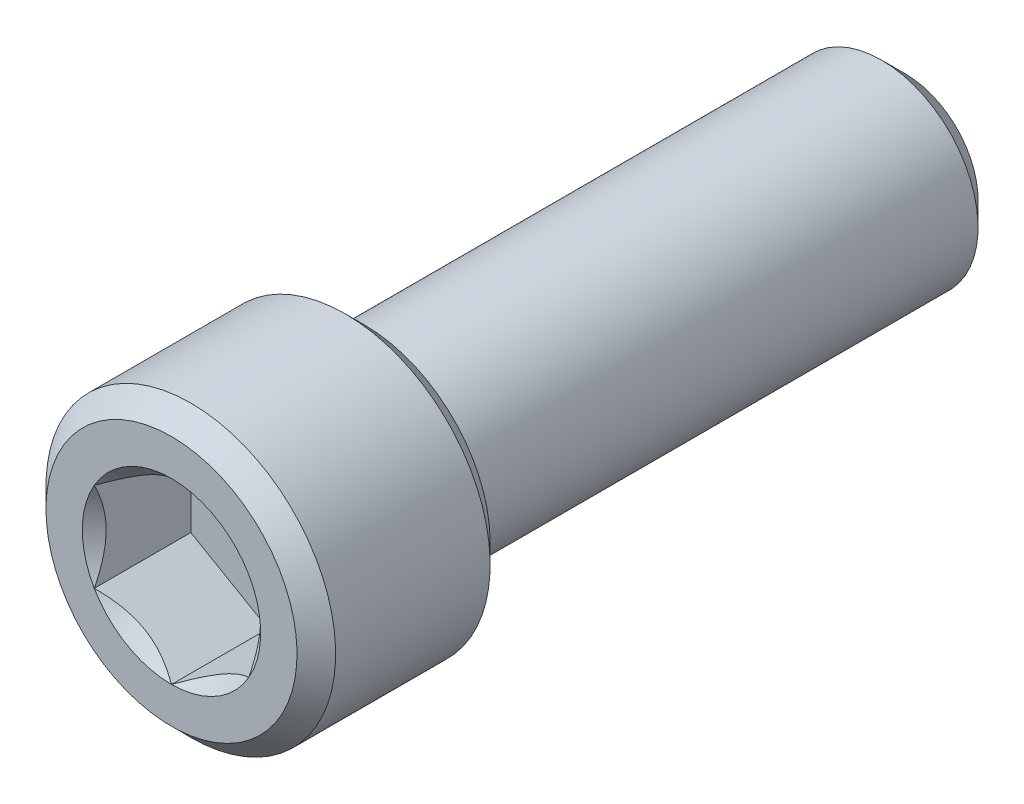
ISO-10303-21;
HEADER;
FILE_DESCRIPTION(('STEP AP214'),'2;1');
FILE_NAME('part.step','',(''),(''),'','','');
FILE_SCHEMA(('AUTOMOTIVE_DESIGN { 1 0 10303 214 1 1 1 1 }'));
ENDSEC;
DATA;
#1=APPLICATION_CONTEXT('core data for automotive mechanical design processes');
#2=APPLICATION_PROTOCOL_DEFINITION('international standard','automotive_design',2000,#1);
#3=PRODUCT_CONTEXT('',#1,'mechanical');
#4=PRODUCT('Part','Part','',(#3));
#5=PRODUCT_RELATED_PRODUCT_CATEGORY('part','',(#4));
#6=PRODUCT_DEFINITION_FORMATION('','',#4);
#7=PRODUCT_DEFINITION_CONTEXT('part definition',#1,'design');
#8=PRODUCT_DEFINITION('design','',#6,#7);
#9=PRODUCT_DEFINITION_SHAPE('','',#8);
#10=(LENGTH_UNIT() NAMED_UNIT(*) SI_UNIT(.MILLI.,.METRE.));
#11=(NAMED_UNIT(*) PLANE_ANGLE_UNIT() SI_UNIT($,.RADIAN.));
#12=(NAMED_UNIT(*) SI_UNIT($,.STERADIAN.) SOLID_ANGLE_UNIT());
#13=UNCERTAINTY_MEASURE_WITH_UNIT(LENGTH_MEASURE(1.E-05),#10,'distance_accuracy_value','');
#14=(GEOMETRIC_REPRESENTATION_CONTEXT(3) GLOBAL_UNCERTAINTY_ASSIGNED_CONTEXT((#13)) GLOBAL_UNIT_ASSIGNED_CONTEXT((#10,
#11,#12)) REPRESENTATION_CONTEXT('',''));
#15=CARTESIAN_POINT('',(0.,0.,0.));
#16=DIRECTION('',(0.,0.,1.));
#17=DIRECTION('',(1.,0.,0.));
#18=AXIS2_PLACEMENT_3D('',#15,#16,#17);
#19=CARTESIAN_POINT('',(0.,2.98732222222222,-15.08125));
#20=DIRECTION('',(0.,0.,-1.));
#21=DIRECTION('',(0.,1.,0.));
#22=AXIS2_PLACEMENT_3D('',#19,#20,#21);
#23=PLANE('',#22);
#24=CARTESIAN_POINT('',(0.,0.,-15.08125));
#25=DIRECTION('',(0.,0.,-1.));
#26=DIRECTION('',(0.,1.,0.));
#27=AXIS2_PLACEMENT_3D('',#24,#25,#26);
#28=CIRCLE('',#27,2.98732222222222);
#29=CARTESIAN_POINT('',(0.,2.98732222222222,-15.08125));
#30=VERTEX_POINT('',#29);
#31=EDGE_CURVE('E203',#30,#30,#28,.T.);
#32=ORIENTED_EDGE('',*,*,#31,.T.);
#33=EDGE_LOOP('',(#32));
#34=FACE_BOUND('',#33,.T.);
#35=ADVANCED_FACE('F34',(#34),#23,.T.);
#36=CARTESIAN_POINT('',(0.,0.,15.08125));
#37=DIRECTION('',(0.,0.,1.));
#38=DIRECTION('',(0.,-1.,0.));
#39=AXIS2_PLACEMENT_3D('',#36,#37,#38);
#40=PLANE('',#39);
#41=CARTESIAN_POINT('',(0.,0.,15.08125));
#42=DIRECTION('',(0.,0.,1.));
#43=DIRECTION('',(1.,0.,0.));
#44=AXIS2_PLACEMENT_3D('',#41,#42,#43);
#45=CIRCLE('',#44,3.66617420935413);
#46=CARTESIAN_POINT('',(0.,-3.66617420935413,15.08125));
#47=VERTEX_POINT('',#46);
#48=CARTESIAN_POINT('',(3.17500000000002,-1.83308710467705,15.08125));
#49=VERTEX_POINT('',#48);
#50=EDGE_CURVE('E103',#47,#49,#45,.T.);
#51=ORIENTED_EDGE('',*,*,#50,.F.);
#52=CARTESIAN_POINT('',(-3.175,-1.83308710467706,15.08125));
#53=VERTEX_POINT('',#52);
#54=EDGE_CURVE('E93',#53,#47,#45,.T.);
#55=ORIENTED_EDGE('',*,*,#54,.F.);
#56=CARTESIAN_POINT('',(-3.17500000000001,1.83308710467706,15.08125));
#57=VERTEX_POINT('',#56);
#58=EDGE_CURVE('E102',#57,#53,#45,.T.);
#59=ORIENTED_EDGE('',*,*,#58,.F.);
#60=CARTESIAN_POINT('',(0.,3.66617420935413,15.08125));
#61=VERTEX_POINT('',#60);
#62=EDGE_CURVE('E53',#61,#57,#45,.T.);
#63=ORIENTED_EDGE('',*,*,#62,.F.);
#64=CARTESIAN_POINT('',(3.175,1.83308710467707,15.08125));
#65=VERTEX_POINT('',#64);
#66=EDGE_CURVE('E60',#65,#61,#45,.T.);
#67=ORIENTED_EDGE('',*,*,#66,.F.);
#68=EDGE_CURVE('E131',#49,#65,#45,.T.);
#69=ORIENTED_EDGE('',*,*,#68,.F.);
#70=EDGE_LOOP('',(#51,#55,#59,#63,#67,#69));
#71=FACE_BOUND('',#70,.T.);
#72=CARTESIAN_POINT('',(0.,0.,15.08125));
#73=DIRECTION('',(0.,0.,-1.));
#74=DIRECTION('',(0.,1.,0.));
#75=AXIS2_PLACEMENT_3D('',#72,#73,#74);
#76=CIRCLE('',#75,5.159375);
#77=CARTESIAN_POINT('',(0.,5.159375,15.08125));
#78=VERTEX_POINT('',#77);
#79=EDGE_CURVE('E47',#78,#78,#76,.T.);
#80=ORIENTED_EDGE('',*,*,#79,.F.);
#81=EDGE_LOOP('',(#80));
#82=FACE_BOUND('',#81,.T.);
#83=ADVANCED_FACE('F129',(#71,#82),#40,.T.);
#84=CARTESIAN_POINT('',(0.,0.,14.2875));
#85=DIRECTION('',(0.,0.,-1.));
#86=DIRECTION('',(0.,1.,0.));
#87=AXIS2_PLACEMENT_3D('',#84,#85,#86);
#88=CONICAL_SURFACE('',#87,5.953125,0.785398163397447);
#89=ORIENTED_EDGE('',*,*,#79,.T.);
#90=EDGE_LOOP('',(#89));
#91=FACE_BOUND('',#90,.T.);
#92=CARTESIAN_POINT('',(0.,0.,14.2875));
#93=DIRECTION('',(0.,0.,-1.));
#94=DIRECTION('',(0.,1.,0.));
#95=AXIS2_PLACEMENT_3D('',#92,#93,#94);
#96=CIRCLE('',#95,5.953125);
#97=CARTESIAN_POINT('',(0.,5.95312499999999,14.2875));
#98=VERTEX_POINT('',#97);
#99=EDGE_CURVE('E222',#98,#98,#96,.T.);
#100=ORIENTED_EDGE('',*,*,#99,.F.);
#101=EDGE_LOOP('',(#100));
#102=FACE_BOUND('',#101,.T.);
#103=ADVANCED_FACE('F200',(#91,#102),#88,.T.);
#104=CARTESIAN_POINT('',(0.,0.,-15.08125));
#105=DIRECTION('',(0.,0.,-1.));
#106=DIRECTION('',(0.,1.,0.));
#107=AXIS2_PLACEMENT_3D('',#104,#105,#106);
#108=CYLINDRICAL_SURFACE('',#107,5.953125);
#109=ORIENTED_EDGE('',*,*,#99,.T.);
#110=EDGE_LOOP('',(#109));
#111=FACE_BOUND('',#110,.T.);
#112=CARTESIAN_POINT('',(0.,0.,7.9375));
#113=DIRECTION('',(0.,0.,-1.));
#114=DIRECTION('',(0.,1.,0.));
#115=AXIS2_PLACEMENT_3D('',#112,#113,#114);
#116=CIRCLE('',#115,5.953125);
#117=CARTESIAN_POINT('',(0.,5.95312499999999,7.9375));
#118=VERTEX_POINT('',#117);
#119=EDGE_CURVE('E219',#118,#118,#116,.T.);
#120=ORIENTED_EDGE('',*,*,#119,.F.);
#121=EDGE_LOOP('',(#120));
#122=FACE_BOUND('',#121,.T.);
#123=ADVANCED_FACE('F229',(#111,#122),#108,.T.);
#124=CARTESIAN_POINT('',(0.,0.,7.14375));
#125=DIRECTION('',(0.,0.,1.));
#126=DIRECTION('',(0.,-1.,0.));
#127=AXIS2_PLACEMENT_3D('',#124,#125,#126);
#128=CONICAL_SURFACE('',#127,5.15937499999999,0.785398163397454);
#129=ORIENTED_EDGE('',*,*,#119,.T.);
#130=EDGE_LOOP('',(#129));
#131=FACE_BOUND('',#130,.T.);
#132=CARTESIAN_POINT('',(0.,0.,7.14375));
#133=DIRECTION('',(0.,0.,-1.));
#134=DIRECTION('',(0.,1.,0.));
#135=AXIS2_PLACEMENT_3D('',#132,#133,#134);
#136=CIRCLE('',#135,5.15937499999999);
#137=CARTESIAN_POINT('',(0.,5.15937499999999,7.14375));
#138=VERTEX_POINT('',#137);
#139=EDGE_CURVE('E216',#138,#138,#136,.T.);
#140=ORIENTED_EDGE('',*,*,#139,.F.);
#141=EDGE_LOOP('',(#140));
#142=FACE_BOUND('',#141,.T.);
#143=ADVANCED_FACE('F235',(#131,#142),#128,.T.);
#144=CARTESIAN_POINT('',(0.,5.15937499999999,7.14375));
#145=DIRECTION('',(0.,0.,-1.));
#146=DIRECTION('',(0.,1.,0.));
#147=AXIS2_PLACEMENT_3D('',#144,#145,#146);
#148=PLANE('',#147);
#149=ORIENTED_EDGE('',*,*,#139,.T.);
#150=EDGE_LOOP('',(#149));
#151=FACE_BOUND('',#150,.T.);
#152=CARTESIAN_POINT('',(0.,0.,7.14375));
#153=DIRECTION('',(0.,0.,-1.));
#154=DIRECTION('',(0.,1.,0.));
#155=AXIS2_PLACEMENT_3D('',#152,#153,#154);
#156=CIRCLE('',#155,3.9751);
#157=CARTESIAN_POINT('',(0.,3.9751,7.14375));
#158=VERTEX_POINT('',#157);
#159=EDGE_CURVE('E208',#158,#158,#156,.T.);
#160=ORIENTED_EDGE('',*,*,#159,.F.);
#161=EDGE_LOOP('',(#160));
#162=FACE_BOUND('',#161,.T.);
#163=ADVANCED_FACE('F241',(#151,#162),#148,.T.);
#164=CARTESIAN_POINT('',(0.,0.,-15.08125));
#165=DIRECTION('',(0.,0.,-1.));
#166=DIRECTION('',(0.,1.,0.));
#167=AXIS2_PLACEMENT_3D('',#164,#165,#166);
#168=CYLINDRICAL_SURFACE('',#167,3.97510000000001);
#169=ORIENTED_EDGE('',*,*,#159,.T.);
#170=EDGE_LOOP('',(#169));
#171=FACE_BOUND('',#170,.T.);
#172=CARTESIAN_POINT('',(0.,0.,-14.0934722222222));
#173=DIRECTION('',(0.,0.,-1.));
#174=DIRECTION('',(0.,1.,0.));
#175=AXIS2_PLACEMENT_3D('',#172,#173,#174);
#176=CIRCLE('',#175,3.97510000000001);
#177=CARTESIAN_POINT('',(0.,3.97510000000001,-14.0934722222222));
#178=VERTEX_POINT('',#177);
#179=EDGE_CURVE('E205',#178,#178,#176,.T.);
#180=ORIENTED_EDGE('',*,*,#179,.F.);
#181=EDGE_LOOP('',(#180));
#182=FACE_BOUND('',#181,.T.);
#183=ADVANCED_FACE('F247',(#171,#182),#168,.T.);
#184=CARTESIAN_POINT('',(0.,0.,-15.08125));
#185=DIRECTION('',(0.,0.,1.));
#186=DIRECTION('',(0.,-1.,0.));
#187=AXIS2_PLACEMENT_3D('',#184,#185,#186);
#188=CONICAL_SURFACE('',#187,2.98732222222222,0.78539816339745);
#189=ORIENTED_EDGE('',*,*,#179,.T.);
#190=EDGE_LOOP('',(#189));
#191=FACE_BOUND('',#190,.T.);
#192=ORIENTED_EDGE('',*,*,#31,.F.);
#193=EDGE_LOOP('',(#192));
#194=FACE_BOUND('',#193,.T.);
#195=ADVANCED_FACE('F253',(#191,#194),#188,.T.);
#196=CARTESIAN_POINT('',(0.,0.,15.08125));
#197=DIRECTION('',(0.,0.,1.));
#198=DIRECTION('',(1.,0.,0.));
#199=AXIS2_PLACEMENT_3D('',#196,#197,#198);
#200=CONICAL_SURFACE('',#199,3.66617420935413,0.78539816339745);
#201=ORIENTED_EDGE('',*,*,#50,.T.);
#202=CARTESIAN_POINT('',(-0.000199999999998825,-3.66628967940796,15.0813654755089));
#203=CARTESIAN_POINT('',(0.108938349949826,-3.60327862368552,15.0184089836918));
#204=CARTESIAN_POINT('',(0.219901628077945,-3.53921394518808,14.9591501042347));
#205=CARTESIAN_POINT('',(0.446167846345947,-3.40857908316253,14.8506486557305));
#206=CARTESIAN_POINT('',(0.561492303252262,-3.34199647692352,14.8014664539387));
#207=CARTESIAN_POINT('',(0.794038522480624,-3.207735854653,14.717216458874));
#208=CARTESIAN_POINT('',(0.911201066281148,-3.14009202845083,14.6819369144994));
#209=CARTESIAN_POINT('',(1.14810544464628,-3.00331522182952,14.6275815701348));
#210=CARTESIAN_POINT('',(1.26784004264355,-2.93418641944448,14.6084651975296));
#211=CARTESIAN_POINT('',(1.47419791875157,-2.81504564412411,14.5912171306232));
#212=CARTESIAN_POINT('',(1.56055470772915,-2.76518752876156,14.5886639336138));
#213=CARTESIAN_POINT('',(1.73312781652471,-2.66555239794355,14.5929662731233));
#214=CARTESIAN_POINT('',(1.8193440764928,-2.61577541704245,14.5998251080214));
#215=CARTESIAN_POINT('',(1.99095979158712,-2.51669303773557,14.6225598833037));
#216=CARTESIAN_POINT('',(2.07635822425327,-2.4673882296474,14.6384459096873));
#217=CARTESIAN_POINT('',(2.24568840330547,-2.36962540518969,14.6783679839979));
#218=CARTESIAN_POINT('',(2.32962026161974,-2.32116732419836,14.7024034070852));
#219=CARTESIAN_POINT('',(2.47862357928411,-2.23514021863469,14.7518552344172));
#220=CARTESIAN_POINT('',(2.54402485119173,-2.19738077669348,14.775971719301));
#221=CARTESIAN_POINT('',(2.6736532502051,-2.12253978562849,14.8280914671371));
#222=CARTESIAN_POINT('',(2.73788034144172,-2.08545825721376,14.8560948486035));
#223=CARTESIAN_POINT('',(2.8649580345126,-2.01208991691129,14.9153605655445));
#224=CARTESIAN_POINT('',(2.92781225074872,-1.97580101824766,14.9466126533542));
#225=CARTESIAN_POINT('',(3.05235662084809,-1.90389529264474,15.0119653443919));
#226=CARTESIAN_POINT('',(3.11404746097871,-1.86827806948879,15.0460641995185));
#227=CARTESIAN_POINT('',(3.1752,-1.83297163462322,15.0813654755089));
#228=B_SPLINE_CURVE_WITH_KNOTS('',3,(#202,#203,#204,#205,#206,#207,#208,#209,#210,#211,#212,
#213,#214,#215,#216,#217,#218,#219,#220,#221,#222,#223,#224,#225,#226,#227),.UNSPECIFIED.,.F.,
.F.,(4,2,2,2,2,2,2,2,2,2,2,2,4),(0.,0.422910572436807,0.848285055427806,1.26690402276127,
1.68446903107506,1.98329272958351,2.28222117546889,2.58148426995465,2.88072442418451,
3.11844134429545,3.35616551414405,3.59316134346766,3.8300126974443),.UNSPECIFIED.);
#229=EDGE_CURVE('E11',#47,#49,#228,.T.);
#230=ORIENTED_EDGE('',*,*,#229,.F.);
#231=EDGE_LOOP('',(#201,#230));
#232=FACE_BOUND('',#231,.T.);
#233=ADVANCED_FACE('F107',(#232),#200,.F.);
#234=ORIENTED_EDGE('',*,*,#68,.T.);
#235=CARTESIAN_POINT('',(3.175,-3.65592387452515,16.2572245261065));
#236=CARTESIAN_POINT('',(3.175,-3.56690614739901,16.1900295572879));
#237=CARTESIAN_POINT('',(3.175,-3.47739001482927,16.1234841167795));
#238=CARTESIAN_POINT('',(3.175,-3.29716433407818,15.991983107989));
#239=CARTESIAN_POINT('',(3.175,-3.20645449195235,15.9270279430093));
#240=CARTESIAN_POINT('',(3.175,-3.02298124672424,15.7985364725883));
#241=CARTESIAN_POINT('',(3.175,-2.93020737789476,15.7350150605195));
#242=CARTESIAN_POINT('',(3.175,-2.74308490461526,15.6103432312395));
#243=CARTESIAN_POINT('',(3.175,-2.64873641209623,15.549192646518));
#244=CARTESIAN_POINT('',(3.175,-2.45276910629101,15.4263772914686));
#245=CARTESIAN_POINT('',(3.175,-2.35104296923552,15.3648829000351));
#246=CARTESIAN_POINT('',(3.175,-2.14521620329061,15.2459400241102));
#247=CARTESIAN_POINT('',(3.175,-2.04111520164361,15.1884921806284));
#248=CARTESIAN_POINT('',(3.175,-1.8305483898592,15.0788819262114));
#249=CARTESIAN_POINT('',(3.175,-1.72409073387149,15.0267039734131));
#250=CARTESIAN_POINT('',(3.175,-1.50827203793058,14.9288015698251));
#251=CARTESIAN_POINT('',(3.175,-1.39891233941784,14.8830741969929));
#252=CARTESIAN_POINT('',(3.175,-1.18604701054559,14.8030561753707));
#253=CARTESIAN_POINT('',(3.175,-1.08277848917347,14.7681413049656));
#254=CARTESIAN_POINT('',(3.175,-0.873755153890323,14.7065963349262));
#255=CARTESIAN_POINT('',(3.175,-0.768000169236097,14.6799668060366));
#256=CARTESIAN_POINT('',(3.175,-0.556394353071963,14.6368261950481));
#257=CARTESIAN_POINT('',(3.175,-0.450579451492891,14.6201417495798));
#258=CARTESIAN_POINT('',(3.175,-0.237818454981044,14.597215141782));
#259=CARTESIAN_POINT('',(3.175,-0.130872557680107,14.5909711844441));
#260=CARTESIAN_POINT('',(3.175,0.079225015083005,14.5893892728023));
#261=CARTESIAN_POINT('',(3.175,0.18237391199382,14.593664748002));
#262=CARTESIAN_POINT('',(3.175,0.387788153537299,14.6120326749881));
#263=CARTESIAN_POINT('',(3.175,0.490053411359906,14.6261260804471));
#264=CARTESIAN_POINT('',(3.175,0.694689208906974,14.6636006951935));
#265=CARTESIAN_POINT('',(3.175,0.797030337701614,14.6871399593543));
#266=CARTESIAN_POINT('',(3.175,0.999482692253838,14.7422509009592));
#267=CARTESIAN_POINT('',(3.175,1.09959410383402,14.7738219063006));
#268=CARTESIAN_POINT('',(3.175,1.30666025401972,14.8469470266187));
#269=CARTESIAN_POINT('',(3.175,1.41338058113121,14.8891582387017));
#270=CARTESIAN_POINT('',(3.175,1.6240351260801,14.9800553663247));
#271=CARTESIAN_POINT('',(3.175,1.72796839622315,15.0287434515018));
#272=CARTESIAN_POINT('',(3.175,1.93357808805447,15.1314437756761));
#273=CARTESIAN_POINT('',(3.175,2.03524592560239,15.1854730621693));
#274=CARTESIAN_POINT('',(3.175,2.23624195707291,15.2976589013647));
#275=CARTESIAN_POINT('',(3.175,2.3355705197654,15.3558147976569));
#276=CARTESIAN_POINT('',(3.175,2.52730642275902,15.4724651155039));
#277=CARTESIAN_POINT('',(3.175,2.61981218330511,15.5307986191933));
#278=CARTESIAN_POINT('',(3.175,2.80323560367684,15.6499186494698));
#279=CARTESIAN_POINT('',(3.175,2.89415314246283,15.7107053618594));
#280=CARTESIAN_POINT('',(3.175,3.07387072487129,15.8337912164829));
#281=CARTESIAN_POINT('',(3.175,3.16268196996071,15.8960740620494));
#282=CARTESIAN_POINT('',(3.175,3.33909075370388,16.0222868324862));
#283=CARTESIAN_POINT('',(3.175,3.42668861940902,16.0862162997018));
#284=CARTESIAN_POINT('',(3.175,3.51377838474595,16.1508189780567));
#285=B_SPLINE_CURVE_WITH_KNOTS('',3,(#235,#236,#237,#238,#239,#240,#241,#242,#243,#244,#245,
#246,#247,#248,#249,#250,#251,#252,#253,#254,#255,#256,#257,#258,#259,#260,#261,#262,#263,#264,
#265,#266,#267,#268,#269,#270,#271,#272,#273,#274,#275,#276,#277,#278,#279,#280,#281,#282,#283,
#284),.UNSPECIFIED.,.F.,.F.,(4,2,2,2,2,2,2,2,2,2,2,2,2,2,2,2,2,2,2,2,2,2,2,2,4),(0.,
0.334601712013316,0.669287419770512,1.00656636796479,1.34382144219389,1.70035269072413,
2.05694029057744,2.41244349871029,2.76778514705124,3.09453137075716,3.42130009774479,
3.74219200698695,4.06302874036784,4.37225254917032,4.6815063988678,4.99616636831741,
5.31080001541913,5.65482708645254,5.99896969199843,6.34424851858141,6.68947254507108,
7.01751396994993,7.34558028700741,7.67098168170701,7.99629359145139),.UNSPECIFIED.);
#286=EDGE_CURVE('E133',#49,#65,#285,.T.);
#287=ORIENTED_EDGE('',*,*,#286,.F.);
#288=EDGE_LOOP('',(#234,#287));
#289=FACE_BOUND('',#288,.T.);
#290=ADVANCED_FACE('F262',(#289),#200,.F.);
#291=ORIENTED_EDGE('',*,*,#66,.T.);
#292=CARTESIAN_POINT('',(3.1752,1.83297163462323,15.0813654755089));
#293=CARTESIAN_POINT('',(3.06606165005017,1.89598269034567,15.0184089836918));
#294=CARTESIAN_POINT('',(2.95509837192206,1.9600473688431,14.9591501042347));
#295=CARTESIAN_POINT('',(2.72883215365405,2.09068223086865,14.8506486557306));
#296=CARTESIAN_POINT('',(2.61350769674774,2.15726483710766,14.8014664539387));
#297=CARTESIAN_POINT('',(2.38096147751938,2.29152545937818,14.717216458874));
#298=CARTESIAN_POINT('',(2.26379893371885,2.35916928558036,14.6819369144994));
#299=CARTESIAN_POINT('',(2.02689455535372,2.49594609220167,14.6275815701348));
#300=CARTESIAN_POINT('',(1.90715995735645,2.5650748945867,14.6084651975296));
#301=CARTESIAN_POINT('',(1.70080208124842,2.68421566990707,14.5912171306232));
#302=CARTESIAN_POINT('',(1.61444529227085,2.73407378526963,14.5886639336138));
#303=CARTESIAN_POINT('',(1.44187218347529,2.83370891608764,14.5929662731233));
#304=CARTESIAN_POINT('',(1.3556559235072,2.88348589698873,14.5998251080214));
#305=CARTESIAN_POINT('',(1.18404020841287,2.98256827629561,14.6225598833037));
#306=CARTESIAN_POINT('',(1.09864177574673,3.03187308438378,14.6384459096873));
#307=CARTESIAN_POINT('',(0.929311596694527,3.1296359088415,14.6783679839979));
#308=CARTESIAN_POINT('',(0.845379738380253,3.17809398983283,14.7024034070852));
#309=CARTESIAN_POINT('',(0.696376420715885,3.2641210953965,14.7518552344172));
#310=CARTESIAN_POINT('',(0.630975148808268,3.30188053733771,14.775971719301));
#311=CARTESIAN_POINT('',(0.501346749794892,3.3767215284027,14.8280914671372));
#312=CARTESIAN_POINT('',(0.437119658558276,3.41380305681743,14.8560948486035));
#313=CARTESIAN_POINT('',(0.310041965487398,3.48717139711989,14.9153605655445));
#314=CARTESIAN_POINT('',(0.247187749251274,3.52346029578352,14.9466126533542));
#315=CARTESIAN_POINT('',(0.122643379151905,3.59536602138645,15.0119653443919));
#316=CARTESIAN_POINT('',(0.0609525390212882,3.63098324454239,15.0460641995185));
#317=CARTESIAN_POINT('',(-0.000200000000002245,3.66628967940796,15.0813654755089));
#318=B_SPLINE_CURVE_WITH_KNOTS('',3,(#292,#293,#294,#295,#296,#297,#298,#299,#300,#301,#302,
#303,#304,#305,#306,#307,#308,#309,#310,#311,#312,#313,#314,#315,#316,#317),.UNSPECIFIED.,.F.,
.F.,(4,2,2,2,2,2,2,2,2,2,2,2,4),(0.,0.422910572436807,0.848285055427806,1.26690402276127,
1.68446903107506,1.98329272958351,2.2822211754689,2.58148426995465,2.88072442418451,
3.11844134429546,3.35616551414405,3.59316134346767,3.8300126974443),.UNSPECIFIED.);
#319=EDGE_CURVE('E141',#65,#61,#318,.T.);
#320=ORIENTED_EDGE('',*,*,#319,.F.);
#321=EDGE_LOOP('',(#291,#320));
#322=FACE_BOUND('',#321,.T.);
#323=ADVANCED_FACE('F304',(#322),#200,.F.);
#324=ORIENTED_EDGE('',*,*,#62,.T.);
#325=CARTESIAN_POINT('',(0.000199999999997233,3.66628967940796,15.0813654755089));
#326=CARTESIAN_POINT('',(-0.108938349949829,3.60327862368552,15.0184089836918));
#327=CARTESIAN_POINT('',(-0.219901628077947,3.53921394518809,14.9591501042347));
#328=CARTESIAN_POINT('',(-0.446167846345948,3.40857908316254,14.8506486557306));
#329=CARTESIAN_POINT('',(-0.561492303252264,3.34199647692353,14.8014664539387));
#330=CARTESIAN_POINT('',(-0.794038522480627,3.207735854653,14.717216458874));
#331=CARTESIAN_POINT('',(-0.911201066281151,3.14009202845083,14.6819369144994));
#332=CARTESIAN_POINT('',(-1.14810544464628,3.00331522182952,14.6275815701348));
#333=CARTESIAN_POINT('',(-1.26784004264355,2.93418641944448,14.6084651975296));
#334=CARTESIAN_POINT('',(-1.47419791875158,2.81504564412412,14.5912171306232));
#335=CARTESIAN_POINT('',(-1.56055470772915,2.76518752876156,14.5886639336138));
#336=CARTESIAN_POINT('',(-1.73312781652472,2.66555239794355,14.5929662731233));
#337=CARTESIAN_POINT('',(-1.8193440764928,2.61577541704245,14.5998251080214));
#338=CARTESIAN_POINT('',(-1.99095979158713,2.51669303773558,14.6225598833037));
#339=CARTESIAN_POINT('',(-2.07635822425327,2.4673882296474,14.6384459096873));
#340=CARTESIAN_POINT('',(-2.24568840330547,2.36962540518969,14.6783679839979));
#341=CARTESIAN_POINT('',(-2.32962026161975,2.32116732419836,14.7024034070852));
#342=CARTESIAN_POINT('',(-2.47862357928412,2.23514021863469,14.7518552344172));
#343=CARTESIAN_POINT('',(-2.54402485119173,2.19738077669348,14.775971719301));
#344=CARTESIAN_POINT('',(-2.67365325020511,2.12253978562849,14.8280914671372));
#345=CARTESIAN_POINT('',(-2.73788034144172,2.08545825721376,14.8560948486035));
#346=CARTESIAN_POINT('',(-2.8649580345126,2.01208991691129,14.9153605655445));
#347=CARTESIAN_POINT('',(-2.92781225074872,1.97580101824767,14.9466126533542));
#348=CARTESIAN_POINT('',(-3.05235662084809,1.90389529264474,15.0119653443919));
#349=CARTESIAN_POINT('',(-3.11404746097871,1.8682780694888,15.0460641995185));
#350=CARTESIAN_POINT('',(-3.1752,1.83297163462323,15.0813654755089));
#351=B_SPLINE_CURVE_WITH_KNOTS('',3,(#325,#326,#327,#328,#329,#330,#331,#332,#333,#334,#335,
#336,#337,#338,#339,#340,#341,#342,#343,#344,#345,#346,#347,#348,#349,#350),.UNSPECIFIED.,.F.,
.F.,(4,2,2,2,2,2,2,2,2,2,2,2,4),(0.,0.422910572436806,0.848285055427806,1.26690402276127,
1.68446903107506,1.98329272958351,2.2822211754689,2.58148426995465,2.88072442418451,
3.11844134429546,3.35616551414405,3.59316134346766,3.83001269744429),.UNSPECIFIED.);
#352=EDGE_CURVE('E161',#61,#57,#351,.T.);
#353=ORIENTED_EDGE('',*,*,#352,.F.);
#354=EDGE_LOOP('',(#324,#353));
#355=FACE_BOUND('',#354,.T.);
#356=ADVANCED_FACE('F300',(#355),#200,.F.);
#357=ORIENTED_EDGE('',*,*,#58,.T.);
#358=CARTESIAN_POINT('',(-3.175,-3.65592387452515,16.2572245261065));
#359=CARTESIAN_POINT('',(-3.175,-3.56690614739901,16.1900295572879));
#360=CARTESIAN_POINT('',(-3.175,-3.47739001482927,16.1234841167795));
#361=CARTESIAN_POINT('',(-3.175,-3.29716433407818,15.991983107989));
#362=CARTESIAN_POINT('',(-3.175,-3.20645449195235,15.9270279430093));
#363=CARTESIAN_POINT('',(-3.175,-3.02298124672424,15.7985364725883));
#364=CARTESIAN_POINT('',(-3.175,-2.93020737789476,15.7350150605195));
#365=CARTESIAN_POINT('',(-3.175,-2.74308490461526,15.6103432312395));
#366=CARTESIAN_POINT('',(-3.175,-2.64873641209623,15.549192646518));
#367=CARTESIAN_POINT('',(-3.175,-2.45276910629101,15.4263772914686));
#368=CARTESIAN_POINT('',(-3.175,-2.35104296923552,15.3648829000351));
#369=CARTESIAN_POINT('',(-3.175,-2.14521620329061,15.2459400241102));
#370=CARTESIAN_POINT('',(-3.175,-2.04111520164361,15.1884921806284));
#371=CARTESIAN_POINT('',(-3.175,-1.8305483898592,15.0788819262114));
#372=CARTESIAN_POINT('',(-3.175,-1.72409073387149,15.0267039734131));
#373=CARTESIAN_POINT('',(-3.175,-1.50827203793058,14.9288015698251));
#374=CARTESIAN_POINT('',(-3.175,-1.39891233941784,14.8830741969929));
#375=CARTESIAN_POINT('',(-3.175,-1.18604701054559,14.8030561753707));
#376=CARTESIAN_POINT('',(-3.175,-1.08277848917347,14.7681413049656));
#377=CARTESIAN_POINT('',(-3.175,-0.873755153890323,14.7065963349262));
#378=CARTESIAN_POINT('',(-3.175,-0.768000169236096,14.6799668060366));
#379=CARTESIAN_POINT('',(-3.175,-0.556394353071962,14.6368261950481));
#380=CARTESIAN_POINT('',(-3.175,-0.450579451492891,14.6201417495798));
#381=CARTESIAN_POINT('',(-3.175,-0.237818454981044,14.597215141782));
#382=CARTESIAN_POINT('',(-3.175,-0.130872557680107,14.5909711844441));
#383=CARTESIAN_POINT('',(-3.175,0.0792250150830045,14.5893892728023));
#384=CARTESIAN_POINT('',(-3.175,0.182373911993819,14.593664748002));
#385=CARTESIAN_POINT('',(-3.175,0.387788153537298,14.6120326749881));
#386=CARTESIAN_POINT('',(-3.175,0.490053411359905,14.6261260804471));
#387=CARTESIAN_POINT('',(-3.175,0.694689208906974,14.6636006951935));
#388=CARTESIAN_POINT('',(-3.175,0.797030337701613,14.6871399593543));
#389=CARTESIAN_POINT('',(-3.175,0.999482692253837,14.7422509009592));
#390=CARTESIAN_POINT('',(-3.175,1.09959410383402,14.7738219063006));
#391=CARTESIAN_POINT('',(-3.175,1.30666025401972,14.8469470266187));
#392=CARTESIAN_POINT('',(-3.175,1.41338058113121,14.8891582387017));
#393=CARTESIAN_POINT('',(-3.175,1.6240351260801,14.9800553663247));
#394=CARTESIAN_POINT('',(-3.175,1.72796839622315,15.0287434515018));
#395=CARTESIAN_POINT('',(-3.175,1.93357808805447,15.1314437756761));
#396=CARTESIAN_POINT('',(-3.175,2.03524592560239,15.1854730621693));
#397=CARTESIAN_POINT('',(-3.175,2.23624195707291,15.2976589013647));
#398=CARTESIAN_POINT('',(-3.175,2.3355705197654,15.3558147976569));
#399=CARTESIAN_POINT('',(-3.175,2.52730642275902,15.4724651155039));
#400=CARTESIAN_POINT('',(-3.175,2.61981218330511,15.5307986191933));
#401=CARTESIAN_POINT('',(-3.175,2.80323560367684,15.6499186494698));
#402=CARTESIAN_POINT('',(-3.175,2.89415314246283,15.7107053618594));
#403=CARTESIAN_POINT('',(-3.175,3.07387072487129,15.8337912164829));
#404=CARTESIAN_POINT('',(-3.175,3.16268196996071,15.8960740620494));
#405=CARTESIAN_POINT('',(-3.175,3.33909075370388,16.0222868324862));
#406=CARTESIAN_POINT('',(-3.175,3.42668861940902,16.0862162997018));
#407=CARTESIAN_POINT('',(-3.175,3.51377838474595,16.1508189780567));
#408=B_SPLINE_CURVE_WITH_KNOTS('',3,(#358,#359,#360,#361,#362,#363,#364,#365,#366,#367,#368,
#369,#370,#371,#372,#373,#374,#375,#376,#377,#378,#379,#380,#381,#382,#383,#384,#385,#386,#387,
#388,#389,#390,#391,#392,#393,#394,#395,#396,#397,#398,#399,#400,#401,#402,#403,#404,#405,#406,
#407),.UNSPECIFIED.,.F.,.F.,(4,2,2,2,2,2,2,2,2,2,2,2,2,2,2,2,2,2,2,2,2,2,2,2,4),(0.,
0.334601712013315,0.66928741977051,1.00656636796479,1.34382144219389,1.70035269072413,
2.05694029057744,2.41244349871028,2.76778514705123,3.09453137075716,3.42130009774478,
3.74219200698695,4.06302874036784,4.37225254917032,4.6815063988678,4.99616636831741,
5.31080001541913,5.65482708645254,5.99896969199843,6.34424851858141,6.68947254507108,
7.01751396994993,7.34558028700741,7.67098168170701,7.99629359145139),.UNSPECIFIED.);
#409=EDGE_CURVE('E119',#57,#53,#408,.F.);
#410=ORIENTED_EDGE('',*,*,#409,.F.);
#411=EDGE_LOOP('',(#357,#410));
#412=FACE_BOUND('',#411,.T.);
#413=ADVANCED_FACE('F154',(#412),#200,.F.);
#414=ORIENTED_EDGE('',*,*,#54,.T.);
#415=CARTESIAN_POINT('',(-3.1752,-1.83297163462322,15.0813654755089));
#416=CARTESIAN_POINT('',(-3.06606165005017,-1.89598269034566,15.0184089836918));
#417=CARTESIAN_POINT('',(-2.95509837192206,-1.9600473688431,14.9591501042347));
#418=CARTESIAN_POINT('',(-2.72883215365405,-2.09068223086865,14.8506486557305));
#419=CARTESIAN_POINT('',(-2.61350769674774,-2.15726483710765,14.8014664539387));
#420=CARTESIAN_POINT('',(-2.38096147751938,-2.29152545937818,14.717216458874));
#421=CARTESIAN_POINT('',(-2.26379893371885,-2.35916928558035,14.6819369144994));
#422=CARTESIAN_POINT('',(-2.02689455535372,-2.49594609220166,14.6275815701348));
#423=CARTESIAN_POINT('',(-1.90715995735645,-2.5650748945867,14.6084651975296));
#424=CARTESIAN_POINT('',(-1.70080208124842,-2.68421566990707,14.5912171306232));
#425=CARTESIAN_POINT('',(-1.61444529227085,-2.73407378526962,14.5886639336138));
#426=CARTESIAN_POINT('',(-1.44187218347529,-2.83370891608763,14.5929662731233));
#427=CARTESIAN_POINT('',(-1.3556559235072,-2.88348589698873,14.5998251080214));
#428=CARTESIAN_POINT('',(-1.18404020841287,-2.98256827629561,14.6225598833037));
#429=CARTESIAN_POINT('',(-1.09864177574673,-3.03187308438378,14.6384459096873));
#430=CARTESIAN_POINT('',(-0.929311596694528,-3.12963590884149,14.6783679839979));
#431=CARTESIAN_POINT('',(-0.845379738380254,-3.17809398983283,14.7024034070852));
#432=CARTESIAN_POINT('',(-0.696376420715886,-3.26412109539649,14.7518552344172));
#433=CARTESIAN_POINT('',(-0.630975148808268,-3.3018805373377,14.775971719301));
#434=CARTESIAN_POINT('',(-0.501346749794893,-3.37672152840269,14.8280914671371));
#435=CARTESIAN_POINT('',(-0.437119658558276,-3.41380305681742,14.8560948486035));
#436=CARTESIAN_POINT('',(-0.310041965487399,-3.48717139711989,14.9153605655445));
#437=CARTESIAN_POINT('',(-0.247187749251275,-3.52346029578352,14.9466126533542));
#438=CARTESIAN_POINT('',(-0.122643379151906,-3.59536602138644,15.0119653443919));
#439=CARTESIAN_POINT('',(-0.060952539021289,-3.63098324454239,15.0460641995185));
#440=CARTESIAN_POINT('',(0.000200000000001666,-3.66628967940796,15.0813654755089));
#441=B_SPLINE_CURVE_WITH_KNOTS('',3,(#415,#416,#417,#418,#419,#420,#421,#422,#423,#424,#425,
#426,#427,#428,#429,#430,#431,#432,#433,#434,#435,#436,#437,#438,#439,#440),.UNSPECIFIED.,.F.,
.F.,(4,2,2,2,2,2,2,2,2,2,2,2,4),(0.,0.422910572436806,0.848285055427807,1.26690402276127,
1.68446903107506,1.98329272958351,2.2822211754689,2.58148426995465,2.88072442418451,
3.11844134429546,3.35616551414405,3.59316134346767,3.8300126974443),.UNSPECIFIED.);
#442=EDGE_CURVE('E97',#53,#47,#441,.T.);
#443=ORIENTED_EDGE('',*,*,#442,.F.);
#444=EDGE_LOOP('',(#414,#443));
#445=FACE_BOUND('',#444,.T.);
#446=ADVANCED_FACE('F95',(#445),#200,.F.);
#447=CARTESIAN_POINT('',(0.,0.,11.1125));
#448=DIRECTION('',(0.,0.,1.));
#449=DIRECTION('',(1.,0.,0.));
#450=AXIS2_PLACEMENT_3D('',#447,#448,#449);
#451=PLANE('',#450);
#452=DIRECTION('',(0.866025403784439,-0.5,0.));
#453=VECTOR('',#452,1.);
#454=CARTESIAN_POINT('',(-3.175,-1.83308710467706,11.1125));
#455=LINE('',#454,#453);
#456=CARTESIAN_POINT('',(-3.175,-1.83308710467706,11.1125));
#457=VERTEX_POINT('',#456);
#458=CARTESIAN_POINT('',(0.,-3.66617420935412,11.1125));
#459=VERTEX_POINT('',#458);
#460=EDGE_CURVE('E118',#457,#459,#455,.T.);
#461=ORIENTED_EDGE('',*,*,#460,.T.);
#462=DIRECTION('',(0.866025403784438,0.5,0.));
#463=VECTOR('',#462,1.);
#464=CARTESIAN_POINT('',(0.,-3.66617420935412,11.1125));
#465=LINE('',#464,#463);
#466=CARTESIAN_POINT('',(3.175,-1.83308710467706,11.1125));
#467=VERTEX_POINT('',#466);
#468=EDGE_CURVE('E123',#459,#467,#465,.T.);
#469=ORIENTED_EDGE('',*,*,#468,.T.);
#470=DIRECTION('',(0.,1.,0.));
#471=VECTOR('',#470,1.);
#472=CARTESIAN_POINT('',(3.175,-1.83308710467706,11.1125));
#473=LINE('',#472,#471);
#474=CARTESIAN_POINT('',(3.175,1.83308710467706,11.1125));
#475=VERTEX_POINT('',#474);
#476=EDGE_CURVE('E277',#467,#475,#473,.T.);
#477=ORIENTED_EDGE('',*,*,#476,.T.);
#478=DIRECTION('',(-0.866025403784439,0.499999999999999,0.));
#479=VECTOR('',#478,1.);
#480=CARTESIAN_POINT('',(3.175,1.83308710467706,11.1125));
#481=LINE('',#480,#479);
#482=CARTESIAN_POINT('',(0.,3.66617420935413,11.1125));
#483=VERTEX_POINT('',#482);
#484=EDGE_CURVE('E281',#475,#483,#481,.T.);
#485=ORIENTED_EDGE('',*,*,#484,.T.);
#486=DIRECTION('',(-0.866025403784438,-0.5,0.));
#487=VECTOR('',#486,1.);
#488=CARTESIAN_POINT('',(0.,3.66617420935413,11.1125));
#489=LINE('',#488,#487);
#490=CARTESIAN_POINT('',(-3.175,1.83308710467706,11.1125));
#491=VERTEX_POINT('',#490);
#492=EDGE_CURVE('E284',#483,#491,#489,.T.);
#493=ORIENTED_EDGE('',*,*,#492,.T.);
#494=DIRECTION('',(0.,-1.,0.));
#495=VECTOR('',#494,1.);
#496=CARTESIAN_POINT('',(-3.175,1.83308710467706,11.1125));
#497=LINE('',#496,#495);
#498=EDGE_CURVE('E126',#491,#457,#497,.T.);
#499=ORIENTED_EDGE('',*,*,#498,.T.);
#500=EDGE_LOOP('',(#461,#469,#477,#485,#493,#499));
#501=FACE_BOUND('',#500,.T.);
#502=ADVANCED_FACE('F153',(#501),#451,.T.);
#503=CARTESIAN_POINT('',(0.,-3.66617420935412,11.1125));
#504=DIRECTION('',(0.5,-0.866025403784438,0.));
#505=DIRECTION('',(0.866025403784438,0.5,0.));
#506=AXIS2_PLACEMENT_3D('',#503,#504,#505);
#507=PLANE('',#506);
#508=DIRECTION('',(0.,0.,1.));
#509=VECTOR('',#508,1.);
#510=CARTESIAN_POINT('',(0.,-3.66617420935412,11.1125));
#511=LINE('',#510,#509);
#512=EDGE_CURVE('E114',#459,#47,#511,.T.);
#513=ORIENTED_EDGE('',*,*,#512,.T.);
#514=ORIENTED_EDGE('',*,*,#229,.T.);
#515=DIRECTION('',(0.,0.,1.));
#516=VECTOR('',#515,1.);
#517=CARTESIAN_POINT('',(3.175,-1.83308710467706,11.1125));
#518=LINE('',#517,#516);
#519=EDGE_CURVE('E125',#467,#49,#518,.T.);
#520=ORIENTED_EDGE('',*,*,#519,.F.);
#521=ORIENTED_EDGE('',*,*,#468,.F.);
#522=EDGE_LOOP('',(#513,#514,#520,#521));
#523=FACE_BOUND('',#522,.T.);
#524=ADVANCED_FACE('F121',(#523),#507,.F.);
#525=CARTESIAN_POINT('',(3.175,-1.83308710467706,11.1125));
#526=DIRECTION('',(1.,0.,0.));
#527=DIRECTION('',(0.,1.,0.));
#528=AXIS2_PLACEMENT_3D('',#525,#526,#527);
#529=PLANE('',#528);
#530=ORIENTED_EDGE('',*,*,#519,.T.);
#531=ORIENTED_EDGE('',*,*,#286,.T.);
#532=DIRECTION('',(0.,0.,1.));
#533=VECTOR('',#532,1.);
#534=CARTESIAN_POINT('',(3.175,1.83308710467706,11.1125));
#535=LINE('',#534,#533);
#536=EDGE_CURVE('E292',#475,#65,#535,.T.);
#537=ORIENTED_EDGE('',*,*,#536,.F.);
#538=ORIENTED_EDGE('',*,*,#476,.F.);
#539=EDGE_LOOP('',(#530,#531,#537,#538));
#540=FACE_BOUND('',#539,.T.);
#541=ADVANCED_FACE('F148',(#540),#529,.F.);
#542=CARTESIAN_POINT('',(3.175,1.83308710467706,11.1125));
#543=DIRECTION('',(0.5,0.866025403784439,0.));
#544=DIRECTION('',(-0.866025403784439,0.5,0.));
#545=AXIS2_PLACEMENT_3D('',#542,#543,#544);
#546=PLANE('',#545);
#547=ORIENTED_EDGE('',*,*,#536,.T.);
#548=ORIENTED_EDGE('',*,*,#319,.T.);
#549=DIRECTION('',(0.,0.,1.));
#550=VECTOR('',#549,1.);
#551=CARTESIAN_POINT('',(0.,3.66617420935413,11.1125));
#552=LINE('',#551,#550);
#553=EDGE_CURVE('E289',#483,#61,#552,.T.);
#554=ORIENTED_EDGE('',*,*,#553,.F.);
#555=ORIENTED_EDGE('',*,*,#484,.F.);
#556=EDGE_LOOP('',(#547,#548,#554,#555));
#557=FACE_BOUND('',#556,.T.);
#558=ADVANCED_FACE('F185',(#557),#546,.F.);
#559=CARTESIAN_POINT('',(0.,3.66617420935413,11.1125));
#560=DIRECTION('',(-0.5,0.866025403784438,0.));
#561=DIRECTION('',(-0.866025403784439,-0.5,0.));
#562=AXIS2_PLACEMENT_3D('',#559,#560,#561);
#563=PLANE('',#562);
#564=ORIENTED_EDGE('',*,*,#553,.T.);
#565=ORIENTED_EDGE('',*,*,#352,.T.);
#566=DIRECTION('',(0.,0.,1.));
#567=VECTOR('',#566,1.);
#568=CARTESIAN_POINT('',(-3.175,1.83308710467706,11.1125));
#569=LINE('',#568,#567);
#570=EDGE_CURVE('E210',#491,#57,#569,.T.);
#571=ORIENTED_EDGE('',*,*,#570,.F.);
#572=ORIENTED_EDGE('',*,*,#492,.F.);
#573=EDGE_LOOP('',(#564,#565,#571,#572));
#574=FACE_BOUND('',#573,.T.);
#575=ADVANCED_FACE('F181',(#574),#563,.F.);
#576=CARTESIAN_POINT('',(-3.175,1.83308710467706,11.1125));
#577=DIRECTION('',(-1.,0.,0.));
#578=DIRECTION('',(0.,-1.,0.));
#579=AXIS2_PLACEMENT_3D('',#576,#577,#578);
#580=PLANE('',#579);
#581=ORIENTED_EDGE('',*,*,#570,.T.);
#582=ORIENTED_EDGE('',*,*,#409,.T.);
#583=DIRECTION('',(0.,0.,1.));
#584=VECTOR('',#583,1.);
#585=CARTESIAN_POINT('',(-3.175,-1.83308710467706,11.1125));
#586=LINE('',#585,#584);
#587=EDGE_CURVE('E116',#457,#53,#586,.T.);
#588=ORIENTED_EDGE('',*,*,#587,.F.);
#589=ORIENTED_EDGE('',*,*,#498,.F.);
#590=EDGE_LOOP('',(#581,#582,#588,#589));
#591=FACE_BOUND('',#590,.T.);
#592=ADVANCED_FACE('F178',(#591),#580,.F.);
#593=CARTESIAN_POINT('',(-3.175,-1.83308710467706,11.1125));
#594=DIRECTION('',(-0.5,-0.866025403784439,0.));
#595=DIRECTION('',(0.866025403784439,-0.5,0.));
#596=AXIS2_PLACEMENT_3D('',#593,#594,#595);
#597=PLANE('',#596);
#598=ORIENTED_EDGE('',*,*,#587,.T.);
#599=ORIENTED_EDGE('',*,*,#442,.T.);
#600=ORIENTED_EDGE('',*,*,#512,.F.);
#601=ORIENTED_EDGE('',*,*,#460,.F.);
#602=EDGE_LOOP('',(#598,#599,#600,#601));
#603=FACE_BOUND('',#602,.T.);
#604=ADVANCED_FACE('F112',(#603),#597,.F.);
#605=CLOSED_SHELL('',(#35,#83,#103,#123,#143,#163,#183,#195,#233,#290,#323,#356,#413,#446,#502,
#524,#541,#558,#575,#592,#604));
#606=MANIFOLD_SOLID_BREP('B2',#605);
#607=ADVANCED_BREP_SHAPE_REPRESENTATION('',(#18,#606),#14);
#608=SHAPE_DEFINITION_REPRESENTATION(#9,#607);
ENDSEC;
END-ISO-10303-21;
